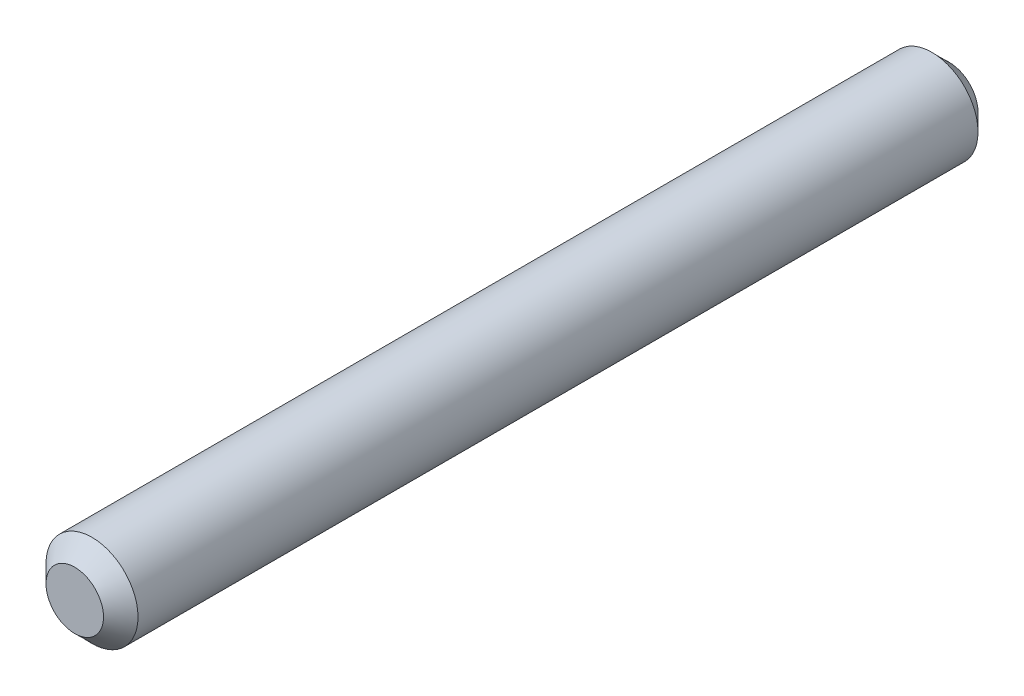
ISO-10303-21;
HEADER;
FILE_DESCRIPTION(('STEP AP214'),'2;1');
FILE_NAME('part.step','',(''),(''),'','','');
FILE_SCHEMA(('AUTOMOTIVE_DESIGN { 1 0 10303 214 1 1 1 1 }'));
ENDSEC;
DATA;
#1=APPLICATION_CONTEXT('core data for automotive mechanical design processes');
#2=APPLICATION_PROTOCOL_DEFINITION('international standard','automotive_design',2000,#1);
#3=PRODUCT_CONTEXT('',#1,'mechanical');
#4=PRODUCT('Part','Part','',(#3));
#5=PRODUCT_RELATED_PRODUCT_CATEGORY('part','',(#4));
#6=PRODUCT_DEFINITION_FORMATION('','',#4);
#7=PRODUCT_DEFINITION_CONTEXT('part definition',#1,'design');
#8=PRODUCT_DEFINITION('design','',#6,#7);
#9=PRODUCT_DEFINITION_SHAPE('','',#8);
#10=(LENGTH_UNIT() NAMED_UNIT(*) SI_UNIT(.MILLI.,.METRE.));
#11=(NAMED_UNIT(*) PLANE_ANGLE_UNIT() SI_UNIT($,.RADIAN.));
#12=(NAMED_UNIT(*) SI_UNIT($,.STERADIAN.) SOLID_ANGLE_UNIT());
#13=UNCERTAINTY_MEASURE_WITH_UNIT(LENGTH_MEASURE(1.E-05),#10,'distance_accuracy_value','');
#14=(GEOMETRIC_REPRESENTATION_CONTEXT(3) GLOBAL_UNCERTAINTY_ASSIGNED_CONTEXT((#13)) GLOBAL_UNIT_ASSIGNED_CONTEXT((#10,
#11,#12)) REPRESENTATION_CONTEXT('',''));
#15=CARTESIAN_POINT('',(0.,0.,0.));
#16=DIRECTION('',(0.,0.,1.));
#17=DIRECTION('',(1.,0.,0.));
#18=AXIS2_PLACEMENT_3D('',#15,#16,#17);
#19=CARTESIAN_POINT('',(0.,0.,76.03));
#20=DIRECTION('',(0.,0.,-1.));
#21=DIRECTION('',(-1.,0.,0.));
#22=AXIS2_PLACEMENT_3D('',#19,#20,#21);
#23=CYLINDRICAL_SURFACE('',#22,4.);
#24=CARTESIAN_POINT('',(0.,0.,74.53));
#25=DIRECTION('',(0.,0.,1.));
#26=DIRECTION('',(1.,0.,0.));
#27=AXIS2_PLACEMENT_3D('',#24,#25,#26);
#28=CIRCLE('',#27,4.);
#29=CARTESIAN_POINT('',(4.,0.,74.53));
#30=VERTEX_POINT('',#29);
#31=EDGE_CURVE('E47',#30,#30,#28,.F.);
#32=ORIENTED_EDGE('',*,*,#31,.T.);
#33=EDGE_LOOP('',(#32));
#34=FACE_BOUND('',#33,.T.);
#35=CARTESIAN_POINT('',(0.,0.,1.5));
#36=DIRECTION('',(0.,0.,1.));
#37=DIRECTION('',(1.,0.,0.));
#38=AXIS2_PLACEMENT_3D('',#35,#36,#37);
#39=CIRCLE('',#38,4.);
#40=CARTESIAN_POINT('',(4.,0.,1.5));
#41=VERTEX_POINT('',#40);
#42=EDGE_CURVE('E51',#41,#41,#39,.T.);
#43=ORIENTED_EDGE('',*,*,#42,.T.);
#44=EDGE_LOOP('',(#43));
#45=FACE_BOUND('',#44,.T.);
#46=ADVANCED_FACE('F39',(#34,#45),#23,.T.);
#47=CARTESIAN_POINT('',(0.,0.,76.03));
#48=DIRECTION('',(0.,0.,1.));
#49=DIRECTION('',(1.,0.,0.));
#50=AXIS2_PLACEMENT_3D('',#47,#48,#49);
#51=PLANE('',#50);
#52=CARTESIAN_POINT('',(0.,0.,76.03));
#53=DIRECTION('',(0.,0.,1.));
#54=DIRECTION('',(1.,0.,0.));
#55=AXIS2_PLACEMENT_3D('',#52,#53,#54);
#56=CIRCLE('',#55,2.5);
#57=CARTESIAN_POINT('',(2.5,0.,76.03));
#58=VERTEX_POINT('',#57);
#59=EDGE_CURVE('E55',#58,#58,#56,.T.);
#60=ORIENTED_EDGE('',*,*,#59,.T.);
#61=EDGE_LOOP('',(#60));
#62=FACE_BOUND('',#61,.T.);
#63=ADVANCED_FACE('F61',(#62),#51,.T.);
#64=CARTESIAN_POINT('',(0.,0.,0.));
#65=DIRECTION('',(0.,0.,1.));
#66=DIRECTION('',(1.,0.,0.));
#67=AXIS2_PLACEMENT_3D('',#64,#65,#66);
#68=PLANE('',#67);
#69=CARTESIAN_POINT('',(0.,0.,0.));
#70=DIRECTION('',(0.,0.,1.));
#71=DIRECTION('',(1.,0.,0.));
#72=AXIS2_PLACEMENT_3D('',#69,#70,#71);
#73=CIRCLE('',#72,2.5);
#74=CARTESIAN_POINT('',(2.5,0.,0.));
#75=VERTEX_POINT('',#74);
#76=EDGE_CURVE('E10',#75,#75,#73,.F.);
#77=ORIENTED_EDGE('',*,*,#76,.T.);
#78=EDGE_LOOP('',(#77));
#79=FACE_BOUND('',#78,.T.);
#80=ADVANCED_FACE('F65',(#79),#68,.F.);
#81=CARTESIAN_POINT('',(0.,0.,76.03));
#82=DIRECTION('',(0.,0.,-1.));
#83=DIRECTION('',(-1.,0.,0.));
#84=AXIS2_PLACEMENT_3D('',#81,#82,#83);
#85=CONICAL_SURFACE('',#84,2.5,0.785398163397449);
#86=ORIENTED_EDGE('',*,*,#31,.F.);
#87=EDGE_LOOP('',(#86));
#88=FACE_BOUND('',#87,.T.);
#89=ORIENTED_EDGE('',*,*,#59,.F.);
#90=EDGE_LOOP('',(#89));
#91=FACE_BOUND('',#90,.T.);
#92=ADVANCED_FACE('F63',(#88,#91),#85,.T.);
#93=CARTESIAN_POINT('',(0.,0.,1.5));
#94=DIRECTION('',(0.,0.,1.));
#95=DIRECTION('',(1.,0.,0.));
#96=AXIS2_PLACEMENT_3D('',#93,#94,#95);
#97=CONICAL_SURFACE('',#96,4.,0.785398163397449);
#98=ORIENTED_EDGE('',*,*,#76,.F.);
#99=EDGE_LOOP('',(#98));
#100=FACE_BOUND('',#99,.T.);
#101=ORIENTED_EDGE('',*,*,#42,.F.);
#102=EDGE_LOOP('',(#101));
#103=FACE_BOUND('',#102,.T.);
#104=ADVANCED_FACE('F42',(#100,#103),#97,.T.);
#105=CLOSED_SHELL('',(#46,#63,#80,#92,#104));
#106=MANIFOLD_SOLID_BREP('B2',#105);
#107=ADVANCED_BREP_SHAPE_REPRESENTATION('',(#18,#106),#14);
#108=SHAPE_DEFINITION_REPRESENTATION(#9,#107);
ENDSEC;
END-ISO-10303-21;
